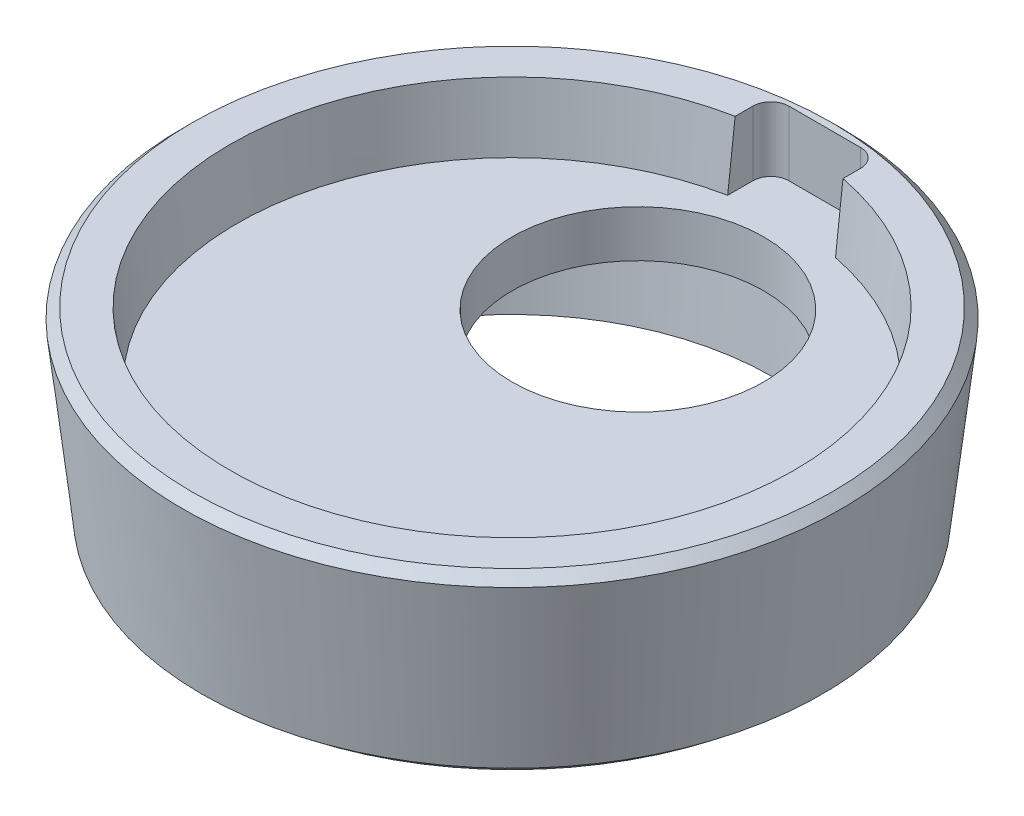
ISO-10303-21;
HEADER;
FILE_DESCRIPTION(('STEP AP214'),'2;1');
FILE_NAME('part.step','',(''),(''),'','','');
FILE_SCHEMA(('AUTOMOTIVE_DESIGN { 1 0 10303 214 1 1 1 1 }'));
ENDSEC;
DATA;
#1=APPLICATION_CONTEXT('core data for automotive mechanical design processes');
#2=APPLICATION_PROTOCOL_DEFINITION('international standard','automotive_design',2000,#1);
#3=PRODUCT_CONTEXT('',#1,'mechanical');
#4=PRODUCT('Part','Part','',(#3));
#5=PRODUCT_RELATED_PRODUCT_CATEGORY('part','',(#4));
#6=PRODUCT_DEFINITION_FORMATION('','',#4);
#7=PRODUCT_DEFINITION_CONTEXT('part definition',#1,'design');
#8=PRODUCT_DEFINITION('design','',#6,#7);
#9=PRODUCT_DEFINITION_SHAPE('','',#8);
#10=(LENGTH_UNIT() NAMED_UNIT(*) SI_UNIT(.MILLI.,.METRE.));
#11=(NAMED_UNIT(*) PLANE_ANGLE_UNIT() SI_UNIT($,.RADIAN.));
#12=(NAMED_UNIT(*) SI_UNIT($,.STERADIAN.) SOLID_ANGLE_UNIT());
#13=UNCERTAINTY_MEASURE_WITH_UNIT(LENGTH_MEASURE(1.E-05),#10,'distance_accuracy_value','');
#14=(GEOMETRIC_REPRESENTATION_CONTEXT(3) GLOBAL_UNCERTAINTY_ASSIGNED_CONTEXT((#13)) GLOBAL_UNIT_ASSIGNED_CONTEXT((#10,
#11,#12)) REPRESENTATION_CONTEXT('',''));
#15=CARTESIAN_POINT('',(0.,0.,0.));
#16=DIRECTION('',(0.,0.,1.));
#17=DIRECTION('',(1.,0.,0.));
#18=AXIS2_PLACEMENT_3D('',#15,#16,#17);
#19=CARTESIAN_POINT('',(0.,7.,-15.2943396226415));
#20=DIRECTION('',(0.,1.,0.));
#21=DIRECTION('',(0.,0.,1.));
#22=AXIS2_PLACEMENT_3D('',#19,#20,#21);
#23=PLANE('',#22);
#24=CARTESIAN_POINT('',(0.,7.,0.));
#25=DIRECTION('',(0.,-1.,0.));
#26=DIRECTION('',(0.,0.,-1.));
#27=AXIS2_PLACEMENT_3D('',#24,#25,#26);
#28=CIRCLE('',#27,15.2943396226415);
#29=CARTESIAN_POINT('',(3.,7.,-14.9972272268144));
#30=VERTEX_POINT('',#29);
#31=CARTESIAN_POINT('',(-3.,7.,-14.9972272268144));
#32=VERTEX_POINT('',#31);
#33=EDGE_CURVE('E200',#30,#32,#28,.T.);
#34=ORIENTED_EDGE('',*,*,#33,.F.);
#35=DIRECTION('',(0.,0.,1.));
#36=VECTOR('',#35,1.);
#37=CARTESIAN_POINT('',(3.,7.,-16.4));
#38=LINE('',#37,#36);
#39=CARTESIAN_POINT('',(3.,7.,-16.4));
#40=VERTEX_POINT('',#39);
#41=EDGE_CURVE('E232',#40,#30,#38,.T.);
#42=ORIENTED_EDGE('',*,*,#41,.F.);
#43=CARTESIAN_POINT('',(2.,7.,-16.4));
#44=DIRECTION('',(0.,1.,0.));
#45=DIRECTION('',(0.,0.,1.));
#46=AXIS2_PLACEMENT_3D('',#43,#44,#45);
#47=CIRCLE('',#46,1.);
#48=CARTESIAN_POINT('',(2.,7.,-17.4));
#49=VERTEX_POINT('',#48);
#50=EDGE_CURVE('E121',#49,#40,#47,.F.);
#51=ORIENTED_EDGE('',*,*,#50,.F.);
#52=DIRECTION('',(1.,0.,0.));
#53=VECTOR('',#52,1.);
#54=CARTESIAN_POINT('',(2.,7.,-17.4));
#55=LINE('',#54,#53);
#56=CARTESIAN_POINT('',(-2.,7.,-17.4));
#57=VERTEX_POINT('',#56);
#58=EDGE_CURVE('E118',#57,#49,#55,.T.);
#59=ORIENTED_EDGE('',*,*,#58,.F.);
#60=CARTESIAN_POINT('',(-2.,7.,-16.4));
#61=DIRECTION('',(0.,1.,0.));
#62=DIRECTION('',(0.,0.,1.));
#63=AXIS2_PLACEMENT_3D('',#60,#61,#62);
#64=CIRCLE('',#63,1.);
#65=CARTESIAN_POINT('',(-3.,7.,-16.4));
#66=VERTEX_POINT('',#65);
#67=EDGE_CURVE('E96',#66,#57,#64,.F.);
#68=ORIENTED_EDGE('',*,*,#67,.F.);
#69=DIRECTION('',(0.,0.,-1.));
#70=VECTOR('',#69,1.);
#71=CARTESIAN_POINT('',(-3.,7.,-16.4));
#72=LINE('',#71,#70);
#73=EDGE_CURVE('E230',#32,#66,#72,.T.);
#74=ORIENTED_EDGE('',*,*,#73,.F.);
#75=EDGE_LOOP('',(#34,#42,#51,#59,#68,#74));
#76=FACE_BOUND('',#75,.T.);
#77=CARTESIAN_POINT('',(0.,7.,-7.));
#78=DIRECTION('',(0.,1.,0.));
#79=DIRECTION('',(0.,0.,1.));
#80=AXIS2_PLACEMENT_3D('',#77,#78,#79);
#81=CIRCLE('',#80,7.);
#82=CARTESIAN_POINT('',(0.,7.,0.));
#83=VERTEX_POINT('',#82);
#84=EDGE_CURVE('E210',#83,#83,#81,.T.);
#85=ORIENTED_EDGE('',*,*,#84,.F.);
#86=EDGE_LOOP('',(#85));
#87=FACE_BOUND('',#86,.T.);
#88=ADVANCED_FACE('F33',(#76,#87),#23,.T.);
#89=CARTESIAN_POINT('',(0.,10.6,0.));
#90=DIRECTION('',(0.,1.,0.));
#91=DIRECTION('',(0.,0.,1.));
#92=AXIS2_PLACEMENT_3D('',#89,#90,#91);
#93=CONICAL_SURFACE('',#92,15.7018867924528,0.112727611590378);
#94=CARTESIAN_POINT('',(3.,0.483229214816966,-14.2440994893975));
#95=CARTESIAN_POINT('',(3.,2.81289371691432,-14.5135897382195));
#96=CARTESIAN_POINT('',(3.,5.14258968227406,-14.7828074376932));
#97=CARTESIAN_POINT('',(3.,9.8020445361017,-15.3206977375498));
#98=CARTESIAN_POINT('',(3.,12.1318034245695,-15.5893703379336));
#99=CARTESIAN_POINT('',(3.,14.4615937762996,-15.8577703889698));
#100=B_SPLINE_CURVE_WITH_KNOTS('',3,(#94,#95,#96,#97,#98,#99),.UNSPECIFIED.,.F.,.F.,(4,2,4),(0.,
7.03559898988782,14.0711979694577),.UNSPECIFIED.);
#101=CARTESIAN_POINT('',(3.,10.6,-15.4126327680577));
#102=VERTEX_POINT('',#101);
#103=EDGE_CURVE('E56',#30,#102,#100,.T.);
#104=ORIENTED_EDGE('',*,*,#103,.F.);
#105=ORIENTED_EDGE('',*,*,#33,.T.);
#106=CARTESIAN_POINT('',(-3.,14.4615937762996,-15.8577703889698));
#107=CARTESIAN_POINT('',(-3.,12.1318034245695,-15.5893703379336));
#108=CARTESIAN_POINT('',(-3.,9.8020445361017,-15.3206977375498));
#109=CARTESIAN_POINT('',(-3.,5.14258968227406,-14.7828074376932));
#110=CARTESIAN_POINT('',(-3.,2.81289371691432,-14.5135897382195));
#111=CARTESIAN_POINT('',(-3.,0.483229214816966,-14.2440994893975));
#112=B_SPLINE_CURVE_WITH_KNOTS('',3,(#106,#107,#108,#109,#110,#111),.UNSPECIFIED.,.F.,.F.,(4,2,
4),(0.,7.03559897956993,14.0711979694577),.UNSPECIFIED.);
#113=CARTESIAN_POINT('',(-3.,10.6,-15.4126327680577));
#114=VERTEX_POINT('',#113);
#115=EDGE_CURVE('E120',#114,#32,#112,.T.);
#116=ORIENTED_EDGE('',*,*,#115,.F.);
#117=CARTESIAN_POINT('',(0.,10.6,0.));
#118=DIRECTION('',(0.,-1.,0.));
#119=DIRECTION('',(0.,0.,-1.));
#120=AXIS2_PLACEMENT_3D('',#117,#118,#119);
#121=CIRCLE('',#120,15.7018867924528);
#122=EDGE_CURVE('E213',#102,#114,#121,.T.);
#123=ORIENTED_EDGE('',*,*,#122,.F.);
#124=EDGE_LOOP('',(#104,#105,#116,#123));
#125=FACE_BOUND('',#124,.T.);
#126=ADVANCED_FACE('F133',(#125),#93,.F.);
#127=CARTESIAN_POINT('',(0.,10.6,-18.4));
#128=DIRECTION('',(0.,1.,0.));
#129=DIRECTION('',(0.,0.,1.));
#130=AXIS2_PLACEMENT_3D('',#127,#128,#129);
#131=PLANE('',#130);
#132=CARTESIAN_POINT('',(0.,10.6,0.));
#133=DIRECTION('',(0.,1.,0.));
#134=DIRECTION('',(0.,0.,1.));
#135=AXIS2_PLACEMENT_3D('',#132,#133,#134);
#136=CIRCLE('',#135,17.8);
#137=CARTESIAN_POINT('',(0.,10.6,17.8));
#138=VERTEX_POINT('',#137);
#139=EDGE_CURVE('E11',#138,#138,#136,.T.);
#140=ORIENTED_EDGE('',*,*,#139,.T.);
#141=EDGE_LOOP('',(#140));
#142=FACE_BOUND('',#141,.T.);
#143=DIRECTION('',(0.,0.,-1.));
#144=VECTOR('',#143,1.);
#145=CARTESIAN_POINT('',(3.,10.6,-18.4));
#146=LINE('',#145,#144);
#147=CARTESIAN_POINT('',(3.,10.6,-16.4));
#148=VERTEX_POINT('',#147);
#149=EDGE_CURVE('E196',#102,#148,#146,.T.);
#150=ORIENTED_EDGE('',*,*,#149,.F.);
#151=ORIENTED_EDGE('',*,*,#122,.T.);
#152=DIRECTION('',(0.,0.,1.));
#153=VECTOR('',#152,1.);
#154=CARTESIAN_POINT('',(-3.,10.6,-16.4));
#155=LINE('',#154,#153);
#156=CARTESIAN_POINT('',(-3.,10.6,-16.4));
#157=VERTEX_POINT('',#156);
#158=EDGE_CURVE('E109',#157,#114,#155,.T.);
#159=ORIENTED_EDGE('',*,*,#158,.F.);
#160=CARTESIAN_POINT('',(-2.,10.6,-16.4));
#161=DIRECTION('',(0.,1.,0.));
#162=DIRECTION('',(0.,0.,-1.));
#163=AXIS2_PLACEMENT_3D('',#160,#161,#162);
#164=CIRCLE('',#163,1.);
#165=CARTESIAN_POINT('',(-2.,10.6,-17.4));
#166=VERTEX_POINT('',#165);
#167=EDGE_CURVE('E93',#166,#157,#164,.T.);
#168=ORIENTED_EDGE('',*,*,#167,.F.);
#169=DIRECTION('',(-1.,0.,0.));
#170=VECTOR('',#169,1.);
#171=CARTESIAN_POINT('',(2.,10.6,-17.4));
#172=LINE('',#171,#170);
#173=CARTESIAN_POINT('',(2.,10.6,-17.4));
#174=VERTEX_POINT('',#173);
#175=EDGE_CURVE('E103',#174,#166,#172,.T.);
#176=ORIENTED_EDGE('',*,*,#175,.F.);
#177=CARTESIAN_POINT('',(2.,10.6,-16.4));
#178=DIRECTION('',(0.,1.,0.));
#179=DIRECTION('',(0.,0.,1.));
#180=AXIS2_PLACEMENT_3D('',#177,#178,#179);
#181=CIRCLE('',#180,1.);
#182=EDGE_CURVE('E48',#148,#174,#181,.T.);
#183=ORIENTED_EDGE('',*,*,#182,.F.);
#184=EDGE_LOOP('',(#150,#151,#159,#168,#176,#183));
#185=FACE_BOUND('',#184,.T.);
#186=ADVANCED_FACE('F107',(#142,#185),#131,.T.);
#187=CARTESIAN_POINT('',(0.,0.,0.));
#188=DIRECTION('',(0.,1.,0.));
#189=DIRECTION('',(0.,0.,1.));
#190=AXIS2_PLACEMENT_3D('',#187,#188,#189);
#191=CONICAL_SURFACE('',#190,17.2,0.112727611590378);
#192=CARTESIAN_POINT('',(0.,0.596191780988964,0.));
#193=DIRECTION('',(0.,-1.,0.));
#194=DIRECTION('',(0.,0.,-1.));
#195=AXIS2_PLACEMENT_3D('',#192,#193,#194);
#196=CIRCLE('',#195,17.2674934091686);
#197=CARTESIAN_POINT('',(0.,0.596191780988964,-17.2674934091686));
#198=VERTEX_POINT('',#197);
#199=EDGE_CURVE('E41',#198,#198,#196,.F.);
#200=ORIENTED_EDGE('',*,*,#199,.T.);
#201=EDGE_LOOP('',(#200));
#202=FACE_BOUND('',#201,.T.);
#203=CARTESIAN_POINT('',(0.,10.0610169491525,0.));
#204=DIRECTION('',(0.,-1.,0.));
#205=DIRECTION('',(0.,0.,-1.));
#206=AXIS2_PLACEMENT_3D('',#203,#204,#205);
#207=CIRCLE('',#206,18.3389830508475);
#208=CARTESIAN_POINT('',(0.,10.0610169491525,-18.3389830508475));
#209=VERTEX_POINT('',#208);
#210=EDGE_CURVE('E195',#209,#209,#207,.T.);
#211=ORIENTED_EDGE('',*,*,#210,.T.);
#212=EDGE_LOOP('',(#211));
#213=FACE_BOUND('',#212,.T.);
#214=ADVANCED_FACE('F167',(#202,#213),#191,.T.);
#215=CARTESIAN_POINT('',(0.,0.,-14.5018867924528));
#216=DIRECTION('',(0.,-1.,0.));
#217=DIRECTION('',(0.,0.,-1.));
#218=AXIS2_PLACEMENT_3D('',#215,#216,#217);
#219=PLANE('',#218);
#220=CARTESIAN_POINT('',(0.,0.,0.));
#221=DIRECTION('',(0.,-1.,0.));
#222=DIRECTION('',(0.,0.,-1.));
#223=AXIS2_PLACEMENT_3D('',#220,#221,#222);
#224=CIRCLE('',#223,16.5190824500547);
#225=CARTESIAN_POINT('',(0.,0.,-16.5190824500547));
#226=VERTEX_POINT('',#225);
#227=EDGE_CURVE('E194',#226,#226,#224,.T.);
#228=ORIENTED_EDGE('',*,*,#227,.T.);
#229=EDGE_LOOP('',(#228));
#230=FACE_BOUND('',#229,.T.);
#231=CARTESIAN_POINT('',(0.,0.,0.));
#232=DIRECTION('',(0.,-1.,0.));
#233=DIRECTION('',(0.,0.,-1.));
#234=AXIS2_PLACEMENT_3D('',#231,#232,#233);
#235=CIRCLE('',#234,14.5018867924528);
#236=CARTESIAN_POINT('',(0.,0.,-14.5018867924528));
#237=VERTEX_POINT('',#236);
#238=EDGE_CURVE('E215',#237,#237,#235,.T.);
#239=ORIENTED_EDGE('',*,*,#238,.F.);
#240=EDGE_LOOP('',(#239));
#241=FACE_BOUND('',#240,.T.);
#242=ADVANCED_FACE('F163',(#230,#241),#219,.T.);
#243=CARTESIAN_POINT('',(0.,4.4,0.));
#244=DIRECTION('',(0.,1.,0.));
#245=DIRECTION('',(0.,0.,1.));
#246=AXIS2_PLACEMENT_3D('',#243,#244,#245);
#247=CONICAL_SURFACE('',#246,15.,0.112727611590378);
#248=ORIENTED_EDGE('',*,*,#238,.T.);
#249=EDGE_LOOP('',(#248));
#250=FACE_BOUND('',#249,.T.);
#251=CARTESIAN_POINT('',(0.,4.4,0.));
#252=DIRECTION('',(0.,-1.,0.));
#253=DIRECTION('',(0.,0.,-1.));
#254=AXIS2_PLACEMENT_3D('',#251,#252,#253);
#255=CIRCLE('',#254,15.);
#256=CARTESIAN_POINT('',(0.,4.4,-15.));
#257=VERTEX_POINT('',#256);
#258=EDGE_CURVE('E209',#257,#257,#255,.T.);
#259=ORIENTED_EDGE('',*,*,#258,.F.);
#260=EDGE_LOOP('',(#259));
#261=FACE_BOUND('',#260,.T.);
#262=ADVANCED_FACE('F159',(#250,#261),#247,.F.);
#263=CARTESIAN_POINT('',(0.,4.4,-15.));
#264=DIRECTION('',(0.,-1.,0.));
#265=DIRECTION('',(0.,0.,-1.));
#266=AXIS2_PLACEMENT_3D('',#263,#264,#265);
#267=PLANE('',#266);
#268=CARTESIAN_POINT('',(0.,4.4,-7.));
#269=DIRECTION('',(0.,-1.,0.));
#270=DIRECTION('',(0.,0.,-1.));
#271=AXIS2_PLACEMENT_3D('',#268,#269,#270);
#272=CIRCLE('',#271,7.);
#273=CARTESIAN_POINT('',(0.,4.4,-14.));
#274=VERTEX_POINT('',#273);
#275=EDGE_CURVE('E206',#274,#274,#272,.T.);
#276=ORIENTED_EDGE('',*,*,#275,.F.);
#277=EDGE_LOOP('',(#276));
#278=FACE_BOUND('',#277,.T.);
#279=ORIENTED_EDGE('',*,*,#258,.T.);
#280=EDGE_LOOP('',(#279));
#281=FACE_BOUND('',#280,.T.);
#282=ADVANCED_FACE('F155',(#278,#281),#267,.T.);
#283=CARTESIAN_POINT('',(0.,0.,-7.));
#284=DIRECTION('',(0.,1.,0.));
#285=DIRECTION('',(0.,0.,1.));
#286=AXIS2_PLACEMENT_3D('',#283,#284,#285);
#287=CYLINDRICAL_SURFACE('',#286,7.);
#288=ORIENTED_EDGE('',*,*,#275,.T.);
#289=EDGE_LOOP('',(#288));
#290=FACE_BOUND('',#289,.T.);
#291=ORIENTED_EDGE('',*,*,#84,.T.);
#292=EDGE_LOOP('',(#291));
#293=FACE_BOUND('',#292,.T.);
#294=ADVANCED_FACE('F152',(#290,#293),#287,.F.);
#295=CARTESIAN_POINT('',(2.,0.456293433209857,-16.4));
#296=DIRECTION('',(0.,1.,0.));
#297=DIRECTION('',(0.,0.,1.));
#298=AXIS2_PLACEMENT_3D('',#295,#296,#297);
#299=CYLINDRICAL_SURFACE('',#298,1.);
#300=ORIENTED_EDGE('',*,*,#50,.T.);
#301=DIRECTION('',(0.,1.,0.));
#302=VECTOR('',#301,1.);
#303=CARTESIAN_POINT('',(3.,0.456293433209857,-16.4));
#304=LINE('',#303,#302);
#305=EDGE_CURVE('E114',#40,#148,#304,.T.);
#306=ORIENTED_EDGE('',*,*,#305,.T.);
#307=ORIENTED_EDGE('',*,*,#182,.T.);
#308=DIRECTION('',(0.,1.,0.));
#309=VECTOR('',#308,1.);
#310=CARTESIAN_POINT('',(2.,0.456293433209857,-17.4));
#311=LINE('',#310,#309);
#312=EDGE_CURVE('E100',#49,#174,#311,.T.);
#313=ORIENTED_EDGE('',*,*,#312,.F.);
#314=EDGE_LOOP('',(#300,#306,#307,#313));
#315=FACE_BOUND('',#314,.T.);
#316=ADVANCED_FACE('F149',(#315),#299,.F.);
#317=CARTESIAN_POINT('',(3.,0.456293433209857,-16.4));
#318=DIRECTION('',(1.,0.,0.));
#319=DIRECTION('',(0.,0.,-1.));
#320=AXIS2_PLACEMENT_3D('',#317,#318,#319);
#321=PLANE('',#320);
#322=ORIENTED_EDGE('',*,*,#103,.T.);
#323=ORIENTED_EDGE('',*,*,#149,.T.);
#324=ORIENTED_EDGE('',*,*,#305,.F.);
#325=ORIENTED_EDGE('',*,*,#41,.T.);
#326=EDGE_LOOP('',(#322,#323,#324,#325));
#327=FACE_BOUND('',#326,.T.);
#328=ADVANCED_FACE('F141',(#327),#321,.F.);
#329=CARTESIAN_POINT('',(-3.,0.456293433209857,-16.4));
#330=DIRECTION('',(-1.,0.,0.));
#331=DIRECTION('',(0.,0.,1.));
#332=AXIS2_PLACEMENT_3D('',#329,#330,#331);
#333=PLANE('',#332);
#334=ORIENTED_EDGE('',*,*,#115,.T.);
#335=ORIENTED_EDGE('',*,*,#73,.T.);
#336=DIRECTION('',(0.,1.,0.));
#337=VECTOR('',#336,1.);
#338=CARTESIAN_POINT('',(-3.,0.456293433209857,-16.4));
#339=LINE('',#338,#337);
#340=EDGE_CURVE('E99',#66,#157,#339,.T.);
#341=ORIENTED_EDGE('',*,*,#340,.T.);
#342=ORIENTED_EDGE('',*,*,#158,.T.);
#343=EDGE_LOOP('',(#334,#335,#341,#342));
#344=FACE_BOUND('',#343,.T.);
#345=ADVANCED_FACE('F137',(#344),#333,.F.);
#346=CARTESIAN_POINT('',(-2.,0.456293433209857,-16.4));
#347=DIRECTION('',(0.,1.,0.));
#348=DIRECTION('',(0.,0.,1.));
#349=AXIS2_PLACEMENT_3D('',#346,#347,#348);
#350=CYLINDRICAL_SURFACE('',#349,1.);
#351=ORIENTED_EDGE('',*,*,#67,.T.);
#352=DIRECTION('',(0.,1.,0.));
#353=VECTOR('',#352,1.);
#354=CARTESIAN_POINT('',(-2.,0.456293433209857,-17.4));
#355=LINE('',#354,#353);
#356=EDGE_CURVE('E88',#57,#166,#355,.T.);
#357=ORIENTED_EDGE('',*,*,#356,.T.);
#358=ORIENTED_EDGE('',*,*,#167,.T.);
#359=ORIENTED_EDGE('',*,*,#340,.F.);
#360=EDGE_LOOP('',(#351,#357,#358,#359));
#361=FACE_BOUND('',#360,.T.);
#362=ADVANCED_FACE('F90',(#361),#350,.F.);
#363=CARTESIAN_POINT('',(2.,0.456293433209857,-17.4));
#364=DIRECTION('',(0.,0.,-1.));
#365=DIRECTION('',(-1.,0.,0.));
#366=AXIS2_PLACEMENT_3D('',#363,#364,#365);
#367=PLANE('',#366);
#368=ORIENTED_EDGE('',*,*,#58,.T.);
#369=ORIENTED_EDGE('',*,*,#312,.T.);
#370=ORIENTED_EDGE('',*,*,#175,.T.);
#371=ORIENTED_EDGE('',*,*,#356,.F.);
#372=EDGE_LOOP('',(#368,#369,#370,#371));
#373=FACE_BOUND('',#372,.T.);
#374=ADVANCED_FACE('F104',(#373),#367,.F.);
#375=CARTESIAN_POINT('',(0.,0.,0.));
#376=DIRECTION('',(0.,1.,0.));
#377=DIRECTION('',(0.,0.,1.));
#378=AXIS2_PLACEMENT_3D('',#375,#376,#377);
#379=CONICAL_SURFACE('',#378,16.5190824500547,0.898125774987827);
#380=ORIENTED_EDGE('',*,*,#199,.F.);
#381=EDGE_LOOP('',(#380));
#382=FACE_BOUND('',#381,.T.);
#383=ORIENTED_EDGE('',*,*,#227,.F.);
#384=EDGE_LOOP('',(#383));
#385=FACE_BOUND('',#384,.T.);
#386=ADVANCED_FACE('F148',(#382,#385),#379,.T.);
#387=CARTESIAN_POINT('',(0.,10.0610169491525,0.));
#388=DIRECTION('',(0.,-1.,0.));
#389=DIRECTION('',(0.,0.,-1.));
#390=AXIS2_PLACEMENT_3D('',#387,#388,#389);
#391=CONICAL_SURFACE('',#390,18.3389830508475,0.785398163397447);
#392=ORIENTED_EDGE('',*,*,#139,.F.);
#393=EDGE_LOOP('',(#392));
#394=FACE_BOUND('',#393,.T.);
#395=ORIENTED_EDGE('',*,*,#210,.F.);
#396=EDGE_LOOP('',(#395));
#397=FACE_BOUND('',#396,.T.);
#398=ADVANCED_FACE('F35',(#394,#397),#391,.T.);
#399=CLOSED_SHELL('',(#88,#126,#186,#214,#242,#262,#282,#294,#316,#328,#345,#362,#374,#386,#398));
#400=MANIFOLD_SOLID_BREP('B2',#399);
#401=ADVANCED_BREP_SHAPE_REPRESENTATION('',(#18,#400),#14);
#402=SHAPE_DEFINITION_REPRESENTATION(#9,#401);
ENDSEC;
END-ISO-10303-21;
